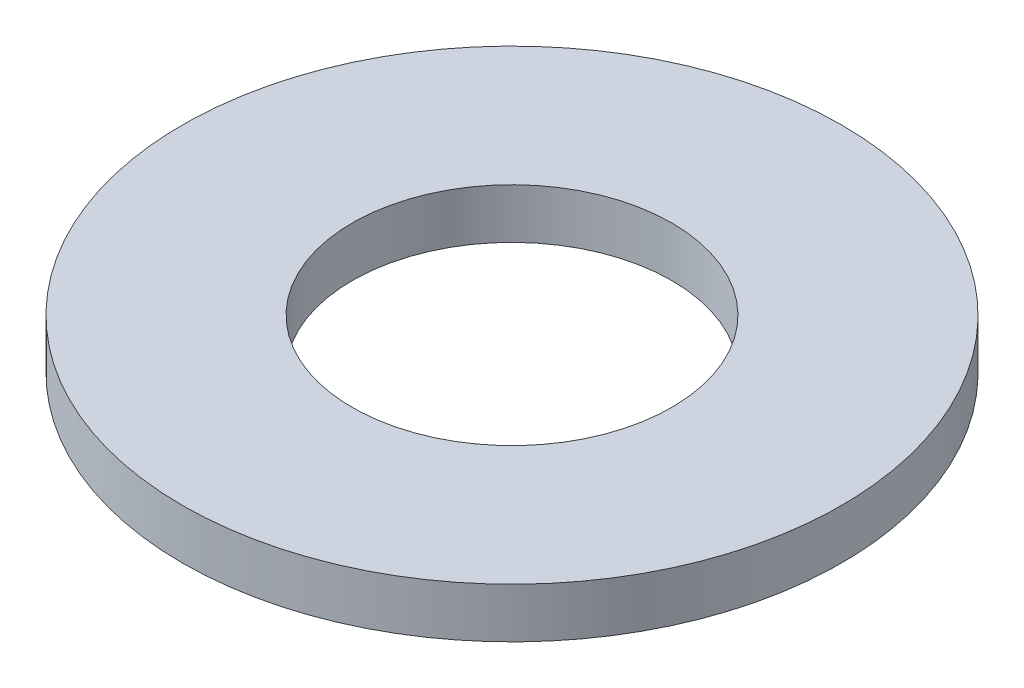
ISO-10303-21;
HEADER;
FILE_DESCRIPTION(('STEP AP214'),'2;1');
FILE_NAME('part.step','',(''),(''),'','','');
FILE_SCHEMA(('AUTOMOTIVE_DESIGN { 1 0 10303 214 1 1 1 1 }'));
ENDSEC;
DATA;
#1=APPLICATION_CONTEXT('core data for automotive mechanical design processes');
#2=APPLICATION_PROTOCOL_DEFINITION('international standard','automotive_design',2000,#1);
#3=PRODUCT_CONTEXT('',#1,'mechanical');
#4=PRODUCT('Part','Part','',(#3));
#5=PRODUCT_RELATED_PRODUCT_CATEGORY('part','',(#4));
#6=PRODUCT_DEFINITION_FORMATION('','',#4);
#7=PRODUCT_DEFINITION_CONTEXT('part definition',#1,'design');
#8=PRODUCT_DEFINITION('design','',#6,#7);
#9=PRODUCT_DEFINITION_SHAPE('','',#8);
#10=(LENGTH_UNIT() NAMED_UNIT(*) SI_UNIT(.MILLI.,.METRE.));
#11=(NAMED_UNIT(*) PLANE_ANGLE_UNIT() SI_UNIT($,.RADIAN.));
#12=(NAMED_UNIT(*) SI_UNIT($,.STERADIAN.) SOLID_ANGLE_UNIT());
#13=UNCERTAINTY_MEASURE_WITH_UNIT(LENGTH_MEASURE(1.E-05),#10,'distance_accuracy_value','');
#14=(GEOMETRIC_REPRESENTATION_CONTEXT(3) GLOBAL_UNCERTAINTY_ASSIGNED_CONTEXT((#13)) GLOBAL_UNIT_ASSIGNED_CONTEXT((#10,
#11,#12)) REPRESENTATION_CONTEXT('',''));
#15=CARTESIAN_POINT('',(0.,0.,0.));
#16=DIRECTION('',(0.,0.,1.));
#17=DIRECTION('',(1.,0.,0.));
#18=AXIS2_PLACEMENT_3D('',#15,#16,#17);
#19=CARTESIAN_POINT('',(0.,0.,0.));
#20=DIRECTION('',(0.,1.,0.));
#21=DIRECTION('',(0.,0.,1.));
#22=AXIS2_PLACEMENT_3D('',#19,#20,#21);
#23=PLANE('',#22);
#24=CARTESIAN_POINT('',(0.,0.,0.));
#25=DIRECTION('',(0.,-1.,0.));
#26=DIRECTION('',(0.,0.,-1.));
#27=AXIS2_PLACEMENT_3D('',#24,#25,#26);
#28=CIRCLE('',#27,1.6);
#29=CARTESIAN_POINT('',(0.,0.,-1.6));
#30=VERTEX_POINT('',#29);
#31=EDGE_CURVE('E27',#30,#30,#28,.F.);
#32=ORIENTED_EDGE('',*,*,#31,.T.);
#33=EDGE_LOOP('',(#32));
#34=FACE_BOUND('',#33,.T.);
#35=CARTESIAN_POINT('',(0.,0.,0.));
#36=DIRECTION('',(0.,-1.,0.));
#37=DIRECTION('',(0.,0.,-1.));
#38=AXIS2_PLACEMENT_3D('',#35,#36,#37);
#39=CIRCLE('',#38,3.3);
#40=CARTESIAN_POINT('',(0.,0.,-3.3));
#41=VERTEX_POINT('',#40);
#42=EDGE_CURVE('E18',#41,#41,#39,.F.);
#43=ORIENTED_EDGE('',*,*,#42,.F.);
#44=EDGE_LOOP('',(#43));
#45=FACE_BOUND('',#44,.T.);
#46=ADVANCED_FACE('F15',(#34,#45),#23,.F.);
#47=CARTESIAN_POINT('',(0.,0.5,0.));
#48=DIRECTION('',(0.,-1.,0.));
#49=DIRECTION('',(0.,0.,-1.));
#50=AXIS2_PLACEMENT_3D('',#47,#48,#49);
#51=CYLINDRICAL_SURFACE('',#50,3.3);
#52=ORIENTED_EDGE('',*,*,#42,.T.);
#53=EDGE_LOOP('',(#52));
#54=FACE_BOUND('',#53,.T.);
#55=CARTESIAN_POINT('',(0.,0.5,0.));
#56=DIRECTION('',(0.,-1.,0.));
#57=DIRECTION('',(0.,0.,-1.));
#58=AXIS2_PLACEMENT_3D('',#55,#56,#57);
#59=CIRCLE('',#58,3.3);
#60=CARTESIAN_POINT('',(0.,0.5,-3.3));
#61=VERTEX_POINT('',#60);
#62=EDGE_CURVE('E22',#61,#61,#59,.F.);
#63=ORIENTED_EDGE('',*,*,#62,.F.);
#64=EDGE_LOOP('',(#63));
#65=FACE_BOUND('',#64,.T.);
#66=ADVANCED_FACE('F35',(#54,#65),#51,.T.);
#67=CARTESIAN_POINT('',(0.,0.5,0.));
#68=DIRECTION('',(0.,-1.,0.));
#69=DIRECTION('',(0.,0.,-1.));
#70=AXIS2_PLACEMENT_3D('',#67,#68,#69);
#71=CYLINDRICAL_SURFACE('',#70,1.6);
#72=CARTESIAN_POINT('',(0.,0.5,0.));
#73=DIRECTION('',(0.,-1.,0.));
#74=DIRECTION('',(0.,0.,-1.));
#75=AXIS2_PLACEMENT_3D('',#72,#73,#74);
#76=CIRCLE('',#75,1.6);
#77=CARTESIAN_POINT('',(0.,0.5,-1.6));
#78=VERTEX_POINT('',#77);
#79=EDGE_CURVE('E10',#78,#78,#76,.T.);
#80=ORIENTED_EDGE('',*,*,#79,.F.);
#81=EDGE_LOOP('',(#80));
#82=FACE_BOUND('',#81,.T.);
#83=ORIENTED_EDGE('',*,*,#31,.F.);
#84=EDGE_LOOP('',(#83));
#85=FACE_BOUND('',#84,.T.);
#86=ADVANCED_FACE('F43',(#82,#85),#71,.F.);
#87=CARTESIAN_POINT('',(0.,0.5,0.));
#88=DIRECTION('',(0.,1.,0.));
#89=DIRECTION('',(0.,0.,1.));
#90=AXIS2_PLACEMENT_3D('',#87,#88,#89);
#91=PLANE('',#90);
#92=ORIENTED_EDGE('',*,*,#79,.T.);
#93=EDGE_LOOP('',(#92));
#94=FACE_BOUND('',#93,.T.);
#95=ORIENTED_EDGE('',*,*,#62,.T.);
#96=EDGE_LOOP('',(#95));
#97=FACE_BOUND('',#96,.T.);
#98=ADVANCED_FACE('F44',(#94,#97),#91,.T.);
#99=CLOSED_SHELL('',(#46,#66,#86,#98));
#100=MANIFOLD_SOLID_BREP('B1',#99);
#101=ADVANCED_BREP_SHAPE_REPRESENTATION('',(#18,#100),#14);
#102=SHAPE_DEFINITION_REPRESENTATION(#9,#101);
ENDSEC;
END-ISO-10303-21;
